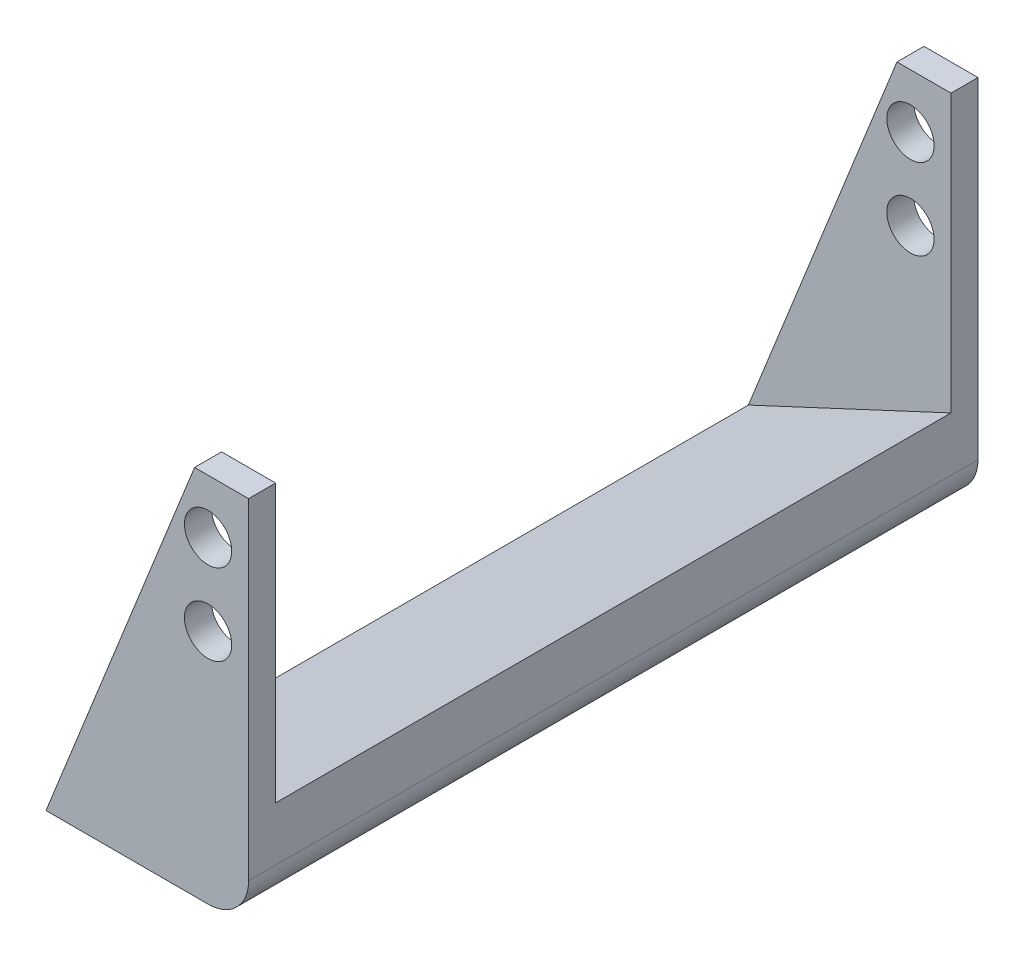
ISO-10303-21;
HEADER;
FILE_DESCRIPTION(('STEP AP214'),'2;1');
FILE_NAME('part.step','',(''),(''),'','','');
FILE_SCHEMA(('AUTOMOTIVE_DESIGN { 1 0 10303 214 1 1 1 1 }'));
ENDSEC;
DATA;
#1=APPLICATION_CONTEXT('core data for automotive mechanical design processes');
#2=APPLICATION_PROTOCOL_DEFINITION('international standard','automotive_design',2000,#1);
#3=PRODUCT_CONTEXT('',#1,'mechanical');
#4=PRODUCT('Part','Part','',(#3));
#5=PRODUCT_RELATED_PRODUCT_CATEGORY('part','',(#4));
#6=PRODUCT_DEFINITION_FORMATION('','',#4);
#7=PRODUCT_DEFINITION_CONTEXT('part definition',#1,'design');
#8=PRODUCT_DEFINITION('design','',#6,#7);
#9=PRODUCT_DEFINITION_SHAPE('','',#8);
#10=(LENGTH_UNIT() NAMED_UNIT(*) SI_UNIT(.MILLI.,.METRE.));
#11=(NAMED_UNIT(*) PLANE_ANGLE_UNIT() SI_UNIT($,.RADIAN.));
#12=(NAMED_UNIT(*) SI_UNIT($,.STERADIAN.) SOLID_ANGLE_UNIT());
#13=UNCERTAINTY_MEASURE_WITH_UNIT(LENGTH_MEASURE(1.E-05),#10,'distance_accuracy_value','');
#14=(GEOMETRIC_REPRESENTATION_CONTEXT(3) GLOBAL_UNCERTAINTY_ASSIGNED_CONTEXT((#13)) GLOBAL_UNIT_ASSIGNED_CONTEXT((#10,
#11,#12)) REPRESENTATION_CONTEXT('',''));
#15=CARTESIAN_POINT('',(0.,0.,0.));
#16=DIRECTION('',(0.,0.,1.));
#17=DIRECTION('',(1.,0.,0.));
#18=AXIS2_PLACEMENT_3D('',#15,#16,#17);
#19=CARTESIAN_POINT('',(15.,6.99461487232487,25.));
#20=DIRECTION('',(0.422618261740694,-0.906307787036653,0.));
#21=DIRECTION('',(0.906307787036653,0.422618261740694,0.));
#22=AXIS2_PLACEMENT_3D('',#19,#20,#21);
#23=PLANE('',#22);
#24=DIRECTION('',(-0.906307787036652,-0.422618261740694,0.));
#25=VECTOR('',#24,1.);
#26=CARTESIAN_POINT('',(15.,6.99461487232487,-25.));
#27=LINE('',#26,#25);
#28=CARTESIAN_POINT('',(15.,6.99461487232487,-25.));
#29=VERTEX_POINT('',#28);
#30=CARTESIAN_POINT('',(0.,0.,-25.));
#31=VERTEX_POINT('',#30);
#32=EDGE_CURVE('E179',#29,#31,#27,.T.);
#33=ORIENTED_EDGE('',*,*,#32,.T.);
#34=DIRECTION('',(0.,0.,-1.));
#35=VECTOR('',#34,1.);
#36=CARTESIAN_POINT('',(0.,0.,25.));
#37=LINE('',#36,#35);
#38=CARTESIAN_POINT('',(0.,0.,25.));
#39=VERTEX_POINT('',#38);
#40=EDGE_CURVE('E111',#39,#31,#37,.T.);
#41=ORIENTED_EDGE('',*,*,#40,.F.);
#42=DIRECTION('',(-0.906307787036652,-0.422618261740694,0.));
#43=VECTOR('',#42,1.);
#44=CARTESIAN_POINT('',(15.,6.99461487232487,25.));
#45=LINE('',#44,#43);
#46=CARTESIAN_POINT('',(15.,6.99461487232487,25.));
#47=VERTEX_POINT('',#46);
#48=EDGE_CURVE('E180',#47,#39,#45,.T.);
#49=ORIENTED_EDGE('',*,*,#48,.F.);
#50=DIRECTION('',(0.,0.,-1.));
#51=VECTOR('',#50,1.);
#52=CARTESIAN_POINT('',(15.,6.99461487232487,25.));
#53=LINE('',#52,#51);
#54=EDGE_CURVE('E183',#47,#29,#53,.T.);
#55=ORIENTED_EDGE('',*,*,#54,.T.);
#56=EDGE_LOOP('',(#33,#41,#49,#55));
#57=FACE_BOUND('',#56,.T.);
#58=ADVANCED_FACE('F37',(#57),#23,.F.);
#59=CARTESIAN_POINT('',(0.,0.,25.));
#60=DIRECTION('',(0.,1.,0.));
#61=DIRECTION('',(0.,0.,1.));
#62=AXIS2_PLACEMENT_3D('',#59,#60,#61);
#63=PLANE('',#62);
#64=DIRECTION('',(1.,0.,0.));
#65=VECTOR('',#64,1.);
#66=CARTESIAN_POINT('',(0.,0.,-27.));
#67=LINE('',#66,#65);
#68=CARTESIAN_POINT('',(0.,0.,-27.));
#69=VERTEX_POINT('',#68);
#70=CARTESIAN_POINT('',(12.,0.,-27.));
#71=VERTEX_POINT('',#70);
#72=EDGE_CURVE('E109',#69,#71,#67,.T.);
#73=ORIENTED_EDGE('',*,*,#72,.T.);
#74=DIRECTION('',(0.,0.,-1.));
#75=VECTOR('',#74,1.);
#76=CARTESIAN_POINT('',(12.,0.,25.));
#77=LINE('',#76,#75);
#78=CARTESIAN_POINT('',(12.,0.,27.));
#79=VERTEX_POINT('',#78);
#80=EDGE_CURVE('E45',#71,#79,#77,.F.);
#81=ORIENTED_EDGE('',*,*,#80,.T.);
#82=DIRECTION('',(1.,0.,0.));
#83=VECTOR('',#82,1.);
#84=CARTESIAN_POINT('',(0.,0.,27.));
#85=LINE('',#84,#83);
#86=CARTESIAN_POINT('',(0.,0.,27.));
#87=VERTEX_POINT('',#86);
#88=EDGE_CURVE('E157',#87,#79,#85,.T.);
#89=ORIENTED_EDGE('',*,*,#88,.F.);
#90=DIRECTION('',(0.,0.,-1.));
#91=VECTOR('',#90,1.);
#92=CARTESIAN_POINT('',(0.,0.,27.));
#93=LINE('',#92,#91);
#94=EDGE_CURVE('E166',#87,#39,#93,.T.);
#95=ORIENTED_EDGE('',*,*,#94,.T.);
#96=ORIENTED_EDGE('',*,*,#40,.T.);
#97=DIRECTION('',(0.,0.,1.));
#98=VECTOR('',#97,1.);
#99=CARTESIAN_POINT('',(0.,0.,-27.));
#100=LINE('',#99,#98);
#101=EDGE_CURVE('E107',#69,#31,#100,.T.);
#102=ORIENTED_EDGE('',*,*,#101,.F.);
#103=EDGE_LOOP('',(#73,#81,#89,#95,#96,#102));
#104=FACE_BOUND('',#103,.T.);
#105=ADVANCED_FACE('F108',(#104),#63,.F.);
#106=CARTESIAN_POINT('',(15.,0.,25.));
#107=DIRECTION('',(-1.,0.,0.));
#108=DIRECTION('',(0.,0.,1.));
#109=AXIS2_PLACEMENT_3D('',#106,#107,#108);
#110=PLANE('',#109);
#111=DIRECTION('',(0.,1.,0.));
#112=VECTOR('',#111,1.);
#113=CARTESIAN_POINT('',(15.,0.,27.));
#114=LINE('',#113,#112);
#115=CARTESIAN_POINT('',(15.,3.,27.));
#116=VERTEX_POINT('',#115);
#117=CARTESIAN_POINT('',(15.,27.5,27.));
#118=VERTEX_POINT('',#117);
#119=EDGE_CURVE('E159',#116,#118,#114,.T.);
#120=ORIENTED_EDGE('',*,*,#119,.F.);
#121=DIRECTION('',(0.,0.,-1.));
#122=VECTOR('',#121,1.);
#123=CARTESIAN_POINT('',(15.,3.,25.));
#124=LINE('',#123,#122);
#125=CARTESIAN_POINT('',(15.,3.,-27.));
#126=VERTEX_POINT('',#125);
#127=EDGE_CURVE('E188',#116,#126,#124,.T.);
#128=ORIENTED_EDGE('',*,*,#127,.T.);
#129=DIRECTION('',(0.,1.,0.));
#130=VECTOR('',#129,1.);
#131=CARTESIAN_POINT('',(15.,0.,-27.));
#132=LINE('',#131,#130);
#133=CARTESIAN_POINT('',(15.,27.5,-27.));
#134=VERTEX_POINT('',#133);
#135=EDGE_CURVE('E129',#126,#134,#132,.T.);
#136=ORIENTED_EDGE('',*,*,#135,.T.);
#137=DIRECTION('',(0.,0.,1.));
#138=VECTOR('',#137,1.);
#139=CARTESIAN_POINT('',(15.,27.5,-27.));
#140=LINE('',#139,#138);
#141=CARTESIAN_POINT('',(15.,27.5,-25.));
#142=VERTEX_POINT('',#141);
#143=EDGE_CURVE('E134',#134,#142,#140,.T.);
#144=ORIENTED_EDGE('',*,*,#143,.T.);
#145=DIRECTION('',(0.,1.,0.));
#146=VECTOR('',#145,1.);
#147=CARTESIAN_POINT('',(15.,0.,-25.));
#148=LINE('',#147,#146);
#149=EDGE_CURVE('E124',#29,#142,#148,.T.);
#150=ORIENTED_EDGE('',*,*,#149,.F.);
#151=ORIENTED_EDGE('',*,*,#54,.F.);
#152=DIRECTION('',(0.,1.,0.));
#153=VECTOR('',#152,1.);
#154=CARTESIAN_POINT('',(15.,0.,25.));
#155=LINE('',#154,#153);
#156=CARTESIAN_POINT('',(15.,27.5,25.));
#157=VERTEX_POINT('',#156);
#158=EDGE_CURVE('E154',#47,#157,#155,.T.);
#159=ORIENTED_EDGE('',*,*,#158,.T.);
#160=DIRECTION('',(0.,0.,-1.));
#161=VECTOR('',#160,1.);
#162=CARTESIAN_POINT('',(15.,27.5,27.));
#163=LINE('',#162,#161);
#164=EDGE_CURVE('E176',#118,#157,#163,.T.);
#165=ORIENTED_EDGE('',*,*,#164,.F.);
#166=EDGE_LOOP('',(#120,#128,#136,#144,#150,#151,#159,#165));
#167=FACE_BOUND('',#166,.T.);
#168=ADVANCED_FACE('F194',(#167),#110,.F.);
#169=CARTESIAN_POINT('',(0.,0.,25.));
#170=DIRECTION('',(0.,0.,1.));
#171=DIRECTION('',(1.,0.,0.));
#172=AXIS2_PLACEMENT_3D('',#169,#170,#171);
#173=PLANE('',#172);
#174=CARTESIAN_POINT('',(12.,23.5,25.));
#175=DIRECTION('',(0.,0.,1.));
#176=DIRECTION('',(1.,0.,0.));
#177=AXIS2_PLACEMENT_3D('',#174,#175,#176);
#178=CIRCLE('',#177,1.75);
#179=CARTESIAN_POINT('',(13.75,23.5,25.));
#180=VERTEX_POINT('',#179);
#181=EDGE_CURVE('E148',#180,#180,#178,.T.);
#182=ORIENTED_EDGE('',*,*,#181,.T.);
#183=EDGE_LOOP('',(#182));
#184=FACE_BOUND('',#183,.T.);
#185=CARTESIAN_POINT('',(12.,17.5,25.));
#186=DIRECTION('',(0.,0.,1.));
#187=DIRECTION('',(1.,0.,0.));
#188=AXIS2_PLACEMENT_3D('',#185,#186,#187);
#189=CIRCLE('',#188,1.75);
#190=CARTESIAN_POINT('',(13.75,17.5,25.));
#191=VERTEX_POINT('',#190);
#192=EDGE_CURVE('E116',#191,#191,#189,.T.);
#193=ORIENTED_EDGE('',*,*,#192,.T.);
#194=EDGE_LOOP('',(#193));
#195=FACE_BOUND('',#194,.T.);
#196=ORIENTED_EDGE('',*,*,#158,.F.);
#197=ORIENTED_EDGE('',*,*,#48,.T.);
#198=DIRECTION('',(-0.371390676354104,-0.928476690885259,0.));
#199=VECTOR('',#198,1.);
#200=CARTESIAN_POINT('',(11.,27.5,25.));
#201=LINE('',#200,#199);
#202=CARTESIAN_POINT('',(11.,27.5,25.));
#203=VERTEX_POINT('',#202);
#204=EDGE_CURVE('E160',#203,#39,#201,.T.);
#205=ORIENTED_EDGE('',*,*,#204,.F.);
#206=DIRECTION('',(-1.,0.,0.));
#207=VECTOR('',#206,1.);
#208=CARTESIAN_POINT('',(15.,27.5,25.));
#209=LINE('',#208,#207);
#210=EDGE_CURVE('E168',#157,#203,#209,.T.);
#211=ORIENTED_EDGE('',*,*,#210,.F.);
#212=EDGE_LOOP('',(#196,#197,#205,#211));
#213=FACE_BOUND('',#212,.T.);
#214=ADVANCED_FACE('F210',(#184,#195,#213),#173,.F.);
#215=CARTESIAN_POINT('',(0.,0.,27.));
#216=DIRECTION('',(0.,0.,1.));
#217=DIRECTION('',(1.,0.,0.));
#218=AXIS2_PLACEMENT_3D('',#215,#216,#217);
#219=PLANE('',#218);
#220=CARTESIAN_POINT('',(12.,23.5,27.));
#221=DIRECTION('',(0.,0.,1.));
#222=DIRECTION('',(1.,0.,0.));
#223=AXIS2_PLACEMENT_3D('',#220,#221,#222);
#224=CIRCLE('',#223,1.75);
#225=CARTESIAN_POINT('',(13.75,23.5,27.));
#226=VERTEX_POINT('',#225);
#227=EDGE_CURVE('E151',#226,#226,#224,.T.);
#228=ORIENTED_EDGE('',*,*,#227,.F.);
#229=EDGE_LOOP('',(#228));
#230=FACE_BOUND('',#229,.T.);
#231=ORIENTED_EDGE('',*,*,#88,.T.);
#232=CARTESIAN_POINT('',(12.,3.,27.));
#233=DIRECTION('',(0.,0.,1.));
#234=DIRECTION('',(1.,0.,0.));
#235=AXIS2_PLACEMENT_3D('',#232,#233,#234);
#236=CIRCLE('',#235,3.);
#237=EDGE_CURVE('E11',#79,#116,#236,.T.);
#238=ORIENTED_EDGE('',*,*,#237,.T.);
#239=ORIENTED_EDGE('',*,*,#119,.T.);
#240=DIRECTION('',(-1.,0.,0.));
#241=VECTOR('',#240,1.);
#242=CARTESIAN_POINT('',(15.,27.5,27.));
#243=LINE('',#242,#241);
#244=CARTESIAN_POINT('',(11.,27.5,27.));
#245=VERTEX_POINT('',#244);
#246=EDGE_CURVE('E162',#118,#245,#243,.T.);
#247=ORIENTED_EDGE('',*,*,#246,.T.);
#248=DIRECTION('',(-0.371390676354104,-0.928476690885259,0.));
#249=VECTOR('',#248,1.);
#250=CARTESIAN_POINT('',(11.,27.5,27.));
#251=LINE('',#250,#249);
#252=EDGE_CURVE('E164',#245,#87,#251,.T.);
#253=ORIENTED_EDGE('',*,*,#252,.T.);
#254=EDGE_LOOP('',(#231,#238,#239,#247,#253));
#255=FACE_BOUND('',#254,.T.);
#256=CARTESIAN_POINT('',(12.,17.5,27.));
#257=DIRECTION('',(0.,0.,1.));
#258=DIRECTION('',(1.,0.,0.));
#259=AXIS2_PLACEMENT_3D('',#256,#257,#258);
#260=CIRCLE('',#259,1.75);
#261=CARTESIAN_POINT('',(13.75,17.5,27.));
#262=VERTEX_POINT('',#261);
#263=EDGE_CURVE('E145',#262,#262,#260,.T.);
#264=ORIENTED_EDGE('',*,*,#263,.F.);
#265=EDGE_LOOP('',(#264));
#266=FACE_BOUND('',#265,.T.);
#267=ADVANCED_FACE('F217',(#230,#255,#266),#219,.T.);
#268=CARTESIAN_POINT('',(15.,27.5,27.));
#269=DIRECTION('',(0.,-1.,0.));
#270=DIRECTION('',(1.,0.,0.));
#271=AXIS2_PLACEMENT_3D('',#268,#269,#270);
#272=PLANE('',#271);
#273=ORIENTED_EDGE('',*,*,#210,.T.);
#274=DIRECTION('',(0.,0.,-1.));
#275=VECTOR('',#274,1.);
#276=CARTESIAN_POINT('',(11.,27.5,27.));
#277=LINE('',#276,#275);
#278=EDGE_CURVE('E173',#245,#203,#277,.T.);
#279=ORIENTED_EDGE('',*,*,#278,.F.);
#280=ORIENTED_EDGE('',*,*,#246,.F.);
#281=ORIENTED_EDGE('',*,*,#164,.T.);
#282=EDGE_LOOP('',(#273,#279,#280,#281));
#283=FACE_BOUND('',#282,.T.);
#284=ADVANCED_FACE('F213',(#283),#272,.F.);
#285=CARTESIAN_POINT('',(11.,27.5,27.));
#286=DIRECTION('',(0.928476690885259,-0.371390676354104,0.));
#287=DIRECTION('',(0.371390676354104,0.928476690885259,0.));
#288=AXIS2_PLACEMENT_3D('',#285,#286,#287);
#289=PLANE('',#288);
#290=ORIENTED_EDGE('',*,*,#204,.T.);
#291=ORIENTED_EDGE('',*,*,#94,.F.);
#292=ORIENTED_EDGE('',*,*,#252,.F.);
#293=ORIENTED_EDGE('',*,*,#278,.T.);
#294=EDGE_LOOP('',(#290,#291,#292,#293));
#295=FACE_BOUND('',#294,.T.);
#296=ADVANCED_FACE('F238',(#295),#289,.F.);
#297=CARTESIAN_POINT('',(12.,23.5,27.));
#298=DIRECTION('',(0.,0.,-1.));
#299=DIRECTION('',(-1.,0.,0.));
#300=AXIS2_PLACEMENT_3D('',#297,#298,#299);
#301=CYLINDRICAL_SURFACE('',#300,1.75);
#302=ORIENTED_EDGE('',*,*,#227,.T.);
#303=EDGE_LOOP('',(#302));
#304=FACE_BOUND('',#303,.T.);
#305=ORIENTED_EDGE('',*,*,#181,.F.);
#306=EDGE_LOOP('',(#305));
#307=FACE_BOUND('',#306,.T.);
#308=ADVANCED_FACE('F241',(#304,#307),#301,.F.);
#309=CARTESIAN_POINT('',(12.,17.5,27.));
#310=DIRECTION('',(0.,0.,-1.));
#311=DIRECTION('',(-1.,0.,0.));
#312=AXIS2_PLACEMENT_3D('',#309,#310,#311);
#313=CYLINDRICAL_SURFACE('',#312,1.75);
#314=ORIENTED_EDGE('',*,*,#263,.T.);
#315=EDGE_LOOP('',(#314));
#316=FACE_BOUND('',#315,.T.);
#317=ORIENTED_EDGE('',*,*,#192,.F.);
#318=EDGE_LOOP('',(#317));
#319=FACE_BOUND('',#318,.T.);
#320=ADVANCED_FACE('F251',(#316,#319),#313,.F.);
#321=CARTESIAN_POINT('',(11.,27.5,-27.));
#322=DIRECTION('',(-0.928476690885259,0.371390676354104,0.));
#323=DIRECTION('',(-0.371390676354104,-0.928476690885259,0.));
#324=AXIS2_PLACEMENT_3D('',#321,#322,#323);
#325=PLANE('',#324);
#326=DIRECTION('',(-0.371390676354104,-0.928476690885259,0.));
#327=VECTOR('',#326,1.);
#328=CARTESIAN_POINT('',(11.,27.5,-25.));
#329=LINE('',#328,#327);
#330=CARTESIAN_POINT('',(11.,27.5,-25.));
#331=VERTEX_POINT('',#330);
#332=EDGE_CURVE('E135',#331,#31,#329,.T.);
#333=ORIENTED_EDGE('',*,*,#332,.F.);
#334=DIRECTION('',(0.,0.,1.));
#335=VECTOR('',#334,1.);
#336=CARTESIAN_POINT('',(11.,27.5,-27.));
#337=LINE('',#336,#335);
#338=CARTESIAN_POINT('',(11.,27.5,-27.));
#339=VERTEX_POINT('',#338);
#340=EDGE_CURVE('E117',#339,#331,#337,.T.);
#341=ORIENTED_EDGE('',*,*,#340,.F.);
#342=DIRECTION('',(-0.371390676354104,-0.928476690885259,0.));
#343=VECTOR('',#342,1.);
#344=CARTESIAN_POINT('',(11.,27.5,-27.));
#345=LINE('',#344,#343);
#346=EDGE_CURVE('E122',#339,#69,#345,.T.);
#347=ORIENTED_EDGE('',*,*,#346,.T.);
#348=ORIENTED_EDGE('',*,*,#101,.T.);
#349=EDGE_LOOP('',(#333,#341,#347,#348));
#350=FACE_BOUND('',#349,.T.);
#351=ADVANCED_FACE('F126',(#350),#325,.T.);
#352=CARTESIAN_POINT('',(15.,27.5,-27.));
#353=DIRECTION('',(0.,1.,0.));
#354=DIRECTION('',(-1.,0.,0.));
#355=AXIS2_PLACEMENT_3D('',#352,#353,#354);
#356=PLANE('',#355);
#357=DIRECTION('',(-1.,0.,0.));
#358=VECTOR('',#357,1.);
#359=CARTESIAN_POINT('',(15.,27.5,-25.));
#360=LINE('',#359,#358);
#361=EDGE_CURVE('E137',#142,#331,#360,.T.);
#362=ORIENTED_EDGE('',*,*,#361,.F.);
#363=ORIENTED_EDGE('',*,*,#143,.F.);
#364=DIRECTION('',(-1.,0.,0.));
#365=VECTOR('',#364,1.);
#366=CARTESIAN_POINT('',(15.,27.5,-27.));
#367=LINE('',#366,#365);
#368=EDGE_CURVE('E127',#134,#339,#367,.T.);
#369=ORIENTED_EDGE('',*,*,#368,.T.);
#370=ORIENTED_EDGE('',*,*,#340,.T.);
#371=EDGE_LOOP('',(#362,#363,#369,#370));
#372=FACE_BOUND('',#371,.T.);
#373=ADVANCED_FACE('F201',(#372),#356,.T.);
#374=CARTESIAN_POINT('',(0.,0.,-27.));
#375=DIRECTION('',(0.,0.,-1.));
#376=DIRECTION('',(1.,0.,0.));
#377=AXIS2_PLACEMENT_3D('',#374,#375,#376);
#378=PLANE('',#377);
#379=CARTESIAN_POINT('',(12.,17.5,-27.));
#380=DIRECTION('',(0.,0.,1.));
#381=DIRECTION('',(1.,0.,0.));
#382=AXIS2_PLACEMENT_3D('',#379,#380,#381);
#383=CIRCLE('',#382,1.75);
#384=CARTESIAN_POINT('',(13.75,17.5,-27.));
#385=VERTEX_POINT('',#384);
#386=EDGE_CURVE('E277',#385,#385,#383,.T.);
#387=ORIENTED_EDGE('',*,*,#386,.T.);
#388=EDGE_LOOP('',(#387));
#389=FACE_BOUND('',#388,.T.);
#390=CARTESIAN_POINT('',(12.,23.5,-27.));
#391=DIRECTION('',(0.,0.,1.));
#392=DIRECTION('',(1.,0.,0.));
#393=AXIS2_PLACEMENT_3D('',#390,#391,#392);
#394=CIRCLE('',#393,1.75);
#395=CARTESIAN_POINT('',(13.75,23.5,-27.));
#396=VERTEX_POINT('',#395);
#397=EDGE_CURVE('E138',#396,#396,#394,.T.);
#398=ORIENTED_EDGE('',*,*,#397,.T.);
#399=EDGE_LOOP('',(#398));
#400=FACE_BOUND('',#399,.T.);
#401=ORIENTED_EDGE('',*,*,#135,.F.);
#402=CARTESIAN_POINT('',(12.,3.,-27.));
#403=DIRECTION('',(0.,0.,-1.));
#404=DIRECTION('',(-1.,0.,0.));
#405=AXIS2_PLACEMENT_3D('',#402,#403,#404);
#406=CIRCLE('',#405,3.);
#407=EDGE_CURVE('E59',#126,#71,#406,.T.);
#408=ORIENTED_EDGE('',*,*,#407,.T.);
#409=ORIENTED_EDGE('',*,*,#72,.F.);
#410=ORIENTED_EDGE('',*,*,#346,.F.);
#411=ORIENTED_EDGE('',*,*,#368,.F.);
#412=EDGE_LOOP('',(#401,#408,#409,#410,#411));
#413=FACE_BOUND('',#412,.T.);
#414=ADVANCED_FACE('F120',(#389,#400,#413),#378,.T.);
#415=CARTESIAN_POINT('',(0.,0.,-25.));
#416=DIRECTION('',(0.,0.,-1.));
#417=DIRECTION('',(1.,0.,0.));
#418=AXIS2_PLACEMENT_3D('',#415,#416,#417);
#419=PLANE('',#418);
#420=ORIENTED_EDGE('',*,*,#32,.F.);
#421=ORIENTED_EDGE('',*,*,#149,.T.);
#422=ORIENTED_EDGE('',*,*,#361,.T.);
#423=ORIENTED_EDGE('',*,*,#332,.T.);
#424=EDGE_LOOP('',(#420,#421,#422,#423));
#425=FACE_BOUND('',#424,.T.);
#426=CARTESIAN_POINT('',(12.,17.5,-25.));
#427=DIRECTION('',(0.,0.,1.));
#428=DIRECTION('',(1.,0.,0.));
#429=AXIS2_PLACEMENT_3D('',#426,#427,#428);
#430=CIRCLE('',#429,1.75);
#431=CARTESIAN_POINT('',(13.75,17.5,-25.));
#432=VERTEX_POINT('',#431);
#433=EDGE_CURVE('E280',#432,#432,#430,.T.);
#434=ORIENTED_EDGE('',*,*,#433,.F.);
#435=EDGE_LOOP('',(#434));
#436=FACE_BOUND('',#435,.T.);
#437=CARTESIAN_POINT('',(12.,23.5,-25.));
#438=DIRECTION('',(0.,0.,1.));
#439=DIRECTION('',(1.,0.,0.));
#440=AXIS2_PLACEMENT_3D('',#437,#438,#439);
#441=CIRCLE('',#440,1.75);
#442=CARTESIAN_POINT('',(13.75,23.5,-25.));
#443=VERTEX_POINT('',#442);
#444=EDGE_CURVE('E275',#443,#443,#441,.T.);
#445=ORIENTED_EDGE('',*,*,#444,.F.);
#446=EDGE_LOOP('',(#445));
#447=FACE_BOUND('',#446,.T.);
#448=ADVANCED_FACE('F260',(#425,#436,#447),#419,.F.);
#449=CARTESIAN_POINT('',(12.,23.5,-27.));
#450=DIRECTION('',(0.,0.,1.));
#451=DIRECTION('',(1.,0.,0.));
#452=AXIS2_PLACEMENT_3D('',#449,#450,#451);
#453=CYLINDRICAL_SURFACE('',#452,1.75);
#454=ORIENTED_EDGE('',*,*,#397,.F.);
#455=EDGE_LOOP('',(#454));
#456=FACE_BOUND('',#455,.T.);
#457=ORIENTED_EDGE('',*,*,#444,.T.);
#458=EDGE_LOOP('',(#457));
#459=FACE_BOUND('',#458,.T.);
#460=ADVANCED_FACE('F225',(#456,#459),#453,.F.);
#461=CARTESIAN_POINT('',(12.,17.5,-27.));
#462=DIRECTION('',(0.,0.,1.));
#463=DIRECTION('',(1.,0.,0.));
#464=AXIS2_PLACEMENT_3D('',#461,#462,#463);
#465=CYLINDRICAL_SURFACE('',#464,1.75);
#466=ORIENTED_EDGE('',*,*,#386,.F.);
#467=EDGE_LOOP('',(#466));
#468=FACE_BOUND('',#467,.T.);
#469=ORIENTED_EDGE('',*,*,#433,.T.);
#470=EDGE_LOOP('',(#469));
#471=FACE_BOUND('',#470,.T.);
#472=ADVANCED_FACE('F221',(#468,#471),#465,.F.);
#473=CARTESIAN_POINT('',(12.,3.,25.));
#474=DIRECTION('',(0.,0.,-1.));
#475=DIRECTION('',(-1.,0.,0.));
#476=AXIS2_PLACEMENT_3D('',#473,#474,#475);
#477=CYLINDRICAL_SURFACE('',#476,3.);
#478=ORIENTED_EDGE('',*,*,#237,.F.);
#479=ORIENTED_EDGE('',*,*,#80,.F.);
#480=ORIENTED_EDGE('',*,*,#407,.F.);
#481=ORIENTED_EDGE('',*,*,#127,.F.);
#482=EDGE_LOOP('',(#478,#479,#480,#481));
#483=FACE_BOUND('',#482,.T.);
#484=ADVANCED_FACE('F39',(#483),#477,.T.);
#485=CLOSED_SHELL('',(#58,#105,#168,#214,#267,#284,#296,#308,#320,#351,#373,#414,#448,#460,#472,#484));
#486=MANIFOLD_SOLID_BREP('B2',#485);
#487=ADVANCED_BREP_SHAPE_REPRESENTATION('',(#18,#486),#14);
#488=SHAPE_DEFINITION_REPRESENTATION(#9,#487);
ENDSEC;
END-ISO-10303-21;
